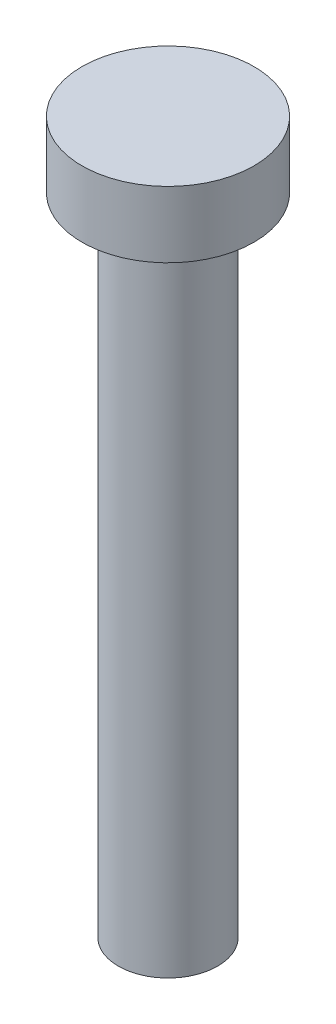
ISO-10303-21;
HEADER;
FILE_DESCRIPTION(('STEP AP214'),'2;1');
FILE_NAME('part.step','',(''),(''),'','','');
FILE_SCHEMA(('AUTOMOTIVE_DESIGN { 1 0 10303 214 1 1 1 1 }'));
ENDSEC;
DATA;
#1=APPLICATION_CONTEXT('core data for automotive mechanical design processes');
#2=APPLICATION_PROTOCOL_DEFINITION('international standard','automotive_design',2000,#1);
#3=PRODUCT_CONTEXT('',#1,'mechanical');
#4=PRODUCT('Part','Part','',(#3));
#5=PRODUCT_RELATED_PRODUCT_CATEGORY('part','',(#4));
#6=PRODUCT_DEFINITION_FORMATION('','',#4);
#7=PRODUCT_DEFINITION_CONTEXT('part definition',#1,'design');
#8=PRODUCT_DEFINITION('design','',#6,#7);
#9=PRODUCT_DEFINITION_SHAPE('','',#8);
#10=(LENGTH_UNIT() NAMED_UNIT(*) SI_UNIT(.MILLI.,.METRE.));
#11=(NAMED_UNIT(*) PLANE_ANGLE_UNIT() SI_UNIT($,.RADIAN.));
#12=(NAMED_UNIT(*) SI_UNIT($,.STERADIAN.) SOLID_ANGLE_UNIT());
#13=UNCERTAINTY_MEASURE_WITH_UNIT(LENGTH_MEASURE(1.E-05),#10,'distance_accuracy_value','');
#14=(GEOMETRIC_REPRESENTATION_CONTEXT(3) GLOBAL_UNCERTAINTY_ASSIGNED_CONTEXT((#13)) GLOBAL_UNIT_ASSIGNED_CONTEXT((#10,
#11,#12)) REPRESENTATION_CONTEXT('',''));
#15=CARTESIAN_POINT('',(0.,0.,0.));
#16=DIRECTION('',(0.,0.,1.));
#17=DIRECTION('',(1.,0.,0.));
#18=AXIS2_PLACEMENT_3D('',#15,#16,#17);
#19=CARTESIAN_POINT('',(-5.2,40.,0.));
#20=DIRECTION('',(0.,1.,0.));
#21=DIRECTION('',(-1.,0.,0.));
#22=AXIS2_PLACEMENT_3D('',#19,#20,#21);
#23=PLANE('',#22);
#24=CARTESIAN_POINT('',(0.,40.,0.));
#25=DIRECTION('',(0.,1.,0.));
#26=DIRECTION('',(-1.,0.,0.));
#27=AXIS2_PLACEMENT_3D('',#24,#25,#26);
#28=CIRCLE('',#27,5.19999999999999);
#29=CARTESIAN_POINT('',(-5.2,40.,0.));
#30=VERTEX_POINT('',#29);
#31=EDGE_CURVE('E41',#30,#30,#28,.F.);
#32=ORIENTED_EDGE('',*,*,#31,.F.);
#33=EDGE_LOOP('',(#32));
#34=FACE_BOUND('',#33,.T.);
#35=ADVANCED_FACE('F38',(#34),#23,.T.);
#36=CARTESIAN_POINT('',(0.,40.,0.));
#37=DIRECTION('',(0.,1.,0.));
#38=DIRECTION('',(-1.,0.,0.));
#39=AXIS2_PLACEMENT_3D('',#36,#37,#38);
#40=CYLINDRICAL_SURFACE('',#39,5.19999999999999);
#41=CARTESIAN_POINT('',(0.,36.,0.));
#42=DIRECTION('',(0.,1.,0.));
#43=DIRECTION('',(-1.,0.,0.));
#44=AXIS2_PLACEMENT_3D('',#41,#42,#43);
#45=CIRCLE('',#44,5.19999999999999);
#46=CARTESIAN_POINT('',(-5.2,36.,0.));
#47=VERTEX_POINT('',#46);
#48=EDGE_CURVE('E45',#47,#47,#45,.F.);
#49=ORIENTED_EDGE('',*,*,#48,.F.);
#50=EDGE_LOOP('',(#49));
#51=FACE_BOUND('',#50,.T.);
#52=ORIENTED_EDGE('',*,*,#31,.T.);
#53=EDGE_LOOP('',(#52));
#54=FACE_BOUND('',#53,.T.);
#55=ADVANCED_FACE('F58',(#51,#54),#40,.T.);
#56=CARTESIAN_POINT('',(-2.99999999999999,36.,0.));
#57=DIRECTION('',(0.,-1.,0.));
#58=DIRECTION('',(1.,0.,0.));
#59=AXIS2_PLACEMENT_3D('',#56,#57,#58);
#60=PLANE('',#59);
#61=ORIENTED_EDGE('',*,*,#48,.T.);
#62=EDGE_LOOP('',(#61));
#63=FACE_BOUND('',#62,.T.);
#64=CARTESIAN_POINT('',(0.,36.,0.));
#65=DIRECTION('',(0.,1.,0.));
#66=DIRECTION('',(-1.,0.,0.));
#67=AXIS2_PLACEMENT_3D('',#64,#65,#66);
#68=CIRCLE('',#67,3.);
#69=CARTESIAN_POINT('',(-3.,36.,0.));
#70=VERTEX_POINT('',#69);
#71=EDGE_CURVE('E10',#70,#70,#68,.F.);
#72=ORIENTED_EDGE('',*,*,#71,.F.);
#73=EDGE_LOOP('',(#72));
#74=FACE_BOUND('',#73,.T.);
#75=ADVANCED_FACE('F65',(#63,#74),#60,.T.);
#76=CARTESIAN_POINT('',(0.,40.,0.));
#77=DIRECTION('',(0.,1.,0.));
#78=DIRECTION('',(-1.,0.,0.));
#79=AXIS2_PLACEMENT_3D('',#76,#77,#78);
#80=CYLINDRICAL_SURFACE('',#79,3.);
#81=ORIENTED_EDGE('',*,*,#71,.T.);
#82=EDGE_LOOP('',(#81));
#83=FACE_BOUND('',#82,.T.);
#84=CARTESIAN_POINT('',(0.,-3.,0.));
#85=DIRECTION('',(0.,-1.,0.));
#86=DIRECTION('',(1.,0.,0.));
#87=AXIS2_PLACEMENT_3D('',#84,#85,#86);
#88=CIRCLE('',#87,3.);
#89=CARTESIAN_POINT('',(3.,-3.,0.));
#90=VERTEX_POINT('',#89);
#91=EDGE_CURVE('E51',#90,#90,#88,.T.);
#92=ORIENTED_EDGE('',*,*,#91,.F.);
#93=EDGE_LOOP('',(#92));
#94=FACE_BOUND('',#93,.T.);
#95=ADVANCED_FACE('F68',(#83,#94),#80,.T.);
#96=CARTESIAN_POINT('',(0.,-3.,0.));
#97=DIRECTION('',(0.,-1.,0.));
#98=DIRECTION('',(1.,0.,0.));
#99=AXIS2_PLACEMENT_3D('',#96,#97,#98);
#100=PLANE('',#99);
#101=ORIENTED_EDGE('',*,*,#91,.T.);
#102=EDGE_LOOP('',(#101));
#103=FACE_BOUND('',#102,.T.);
#104=ADVANCED_FACE('F61',(#103),#100,.T.);
#105=CLOSED_SHELL('',(#35,#55,#75,#95,#104));
#106=MANIFOLD_SOLID_BREP('B2',#105);
#107=ADVANCED_BREP_SHAPE_REPRESENTATION('',(#18,#106),#14);
#108=SHAPE_DEFINITION_REPRESENTATION(#9,#107);
ENDSEC;
END-ISO-10303-21;
